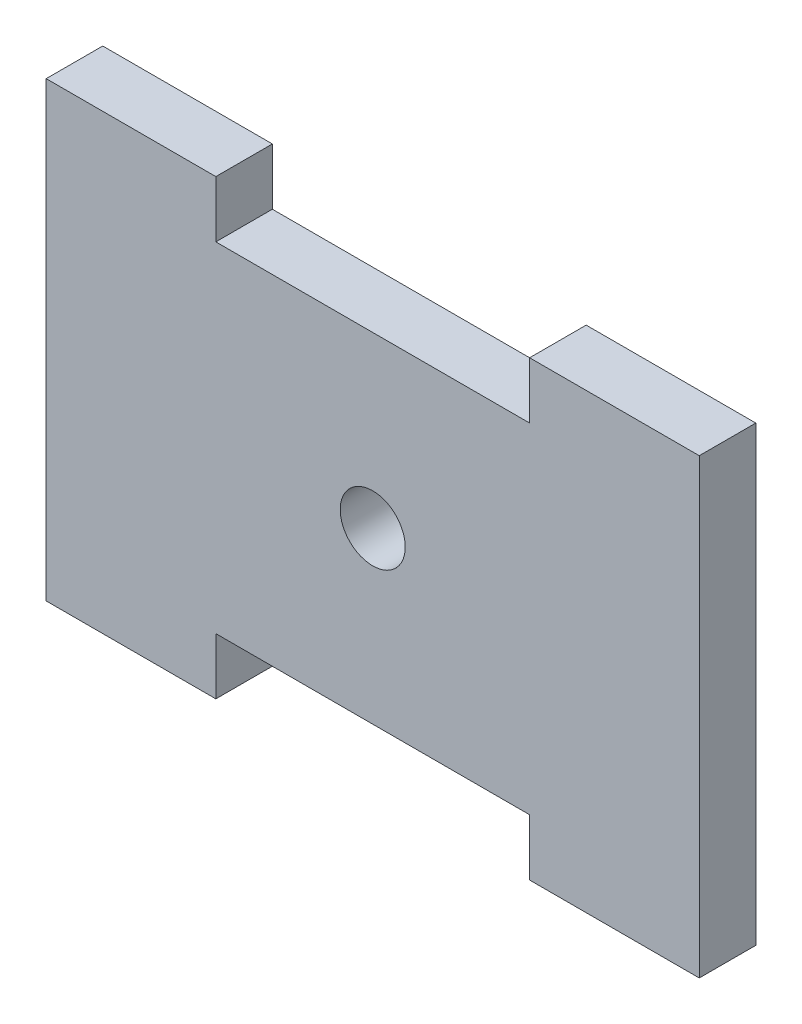
ISO-10303-21;
HEADER;
FILE_DESCRIPTION(('STEP AP214'),'2;1');
FILE_NAME('part.step','',(''),(''),'','','');
FILE_SCHEMA(('AUTOMOTIVE_DESIGN { 1 0 10303 214 1 1 1 1 }'));
ENDSEC;
DATA;
#1=APPLICATION_CONTEXT('core data for automotive mechanical design processes');
#2=APPLICATION_PROTOCOL_DEFINITION('international standard','automotive_design',2000,#1);
#3=PRODUCT_CONTEXT('',#1,'mechanical');
#4=PRODUCT('Part','Part','',(#3));
#5=PRODUCT_RELATED_PRODUCT_CATEGORY('part','',(#4));
#6=PRODUCT_DEFINITION_FORMATION('','',#4);
#7=PRODUCT_DEFINITION_CONTEXT('part definition',#1,'design');
#8=PRODUCT_DEFINITION('design','',#6,#7);
#9=PRODUCT_DEFINITION_SHAPE('','',#8);
#10=(LENGTH_UNIT() NAMED_UNIT(*) SI_UNIT(.MILLI.,.METRE.));
#11=(NAMED_UNIT(*) PLANE_ANGLE_UNIT() SI_UNIT($,.RADIAN.));
#12=(NAMED_UNIT(*) SI_UNIT($,.STERADIAN.) SOLID_ANGLE_UNIT());
#13=UNCERTAINTY_MEASURE_WITH_UNIT(LENGTH_MEASURE(1.E-05),#10,'distance_accuracy_value','');
#14=(GEOMETRIC_REPRESENTATION_CONTEXT(3) GLOBAL_UNCERTAINTY_ASSIGNED_CONTEXT((#13)) GLOBAL_UNIT_ASSIGNED_CONTEXT((#10,
#11,#12)) REPRESENTATION_CONTEXT('',''));
#15=CARTESIAN_POINT('',(0.,0.,0.));
#16=DIRECTION('',(0.,0.,1.));
#17=DIRECTION('',(1.,0.,0.));
#18=AXIS2_PLACEMENT_3D('',#15,#16,#17);
#19=CARTESIAN_POINT('',(3.00000000000001,0.,2.));
#20=DIRECTION('',(-1.,0.,0.));
#21=DIRECTION('',(0.,-1.,0.));
#22=AXIS2_PLACEMENT_3D('',#19,#20,#21);
#23=PLANE('',#22);
#24=DIRECTION('',(0.,1.,0.));
#25=VECTOR('',#24,1.);
#26=CARTESIAN_POINT('',(3.00000000000001,0.,0.));
#27=LINE('',#26,#25);
#28=CARTESIAN_POINT('',(3.,-15.,0.));
#29=VERTEX_POINT('',#28);
#30=CARTESIAN_POINT('',(3.,-13.,0.));
#31=VERTEX_POINT('',#30);
#32=EDGE_CURVE('E174',#29,#31,#27,.T.);
#33=ORIENTED_EDGE('',*,*,#32,.T.);
#34=DIRECTION('',(0.,0.,-1.));
#35=VECTOR('',#34,1.);
#36=CARTESIAN_POINT('',(3.,-13.,2.));
#37=LINE('',#36,#35);
#38=CARTESIAN_POINT('',(3.,-13.,2.));
#39=VERTEX_POINT('',#38);
#40=EDGE_CURVE('E11',#39,#31,#37,.T.);
#41=ORIENTED_EDGE('',*,*,#40,.F.);
#42=DIRECTION('',(0.,1.,0.));
#43=VECTOR('',#42,1.);
#44=CARTESIAN_POINT('',(3.00000000000001,0.,2.));
#45=LINE('',#44,#43);
#46=CARTESIAN_POINT('',(3.,-15.,2.));
#47=VERTEX_POINT('',#46);
#48=EDGE_CURVE('E267',#47,#39,#45,.T.);
#49=ORIENTED_EDGE('',*,*,#48,.F.);
#50=DIRECTION('',(0.,0.,-1.));
#51=VECTOR('',#50,1.);
#52=CARTESIAN_POINT('',(3.,-15.,2.));
#53=LINE('',#52,#51);
#54=EDGE_CURVE('E169',#47,#29,#53,.T.);
#55=ORIENTED_EDGE('',*,*,#54,.T.);
#56=EDGE_LOOP('',(#33,#41,#49,#55));
#57=FACE_BOUND('',#56,.T.);
#58=ADVANCED_FACE('F41',(#57),#23,.F.);
#59=CARTESIAN_POINT('',(0.,-13.,2.));
#60=DIRECTION('',(0.,1.,0.));
#61=DIRECTION('',(0.,0.,1.));
#62=AXIS2_PLACEMENT_3D('',#59,#60,#61);
#63=PLANE('',#62);
#64=DIRECTION('',(1.,0.,0.));
#65=VECTOR('',#64,1.);
#66=CARTESIAN_POINT('',(0.,-13.,0.));
#67=LINE('',#66,#65);
#68=CARTESIAN_POINT('',(14.1,-13.,0.));
#69=VERTEX_POINT('',#68);
#70=EDGE_CURVE('E178',#31,#69,#67,.T.);
#71=ORIENTED_EDGE('',*,*,#70,.T.);
#72=DIRECTION('',(0.,0.,-1.));
#73=VECTOR('',#72,1.);
#74=CARTESIAN_POINT('',(14.1,-13.,2.));
#75=LINE('',#74,#73);
#76=CARTESIAN_POINT('',(14.1,-13.,2.));
#77=VERTEX_POINT('',#76);
#78=EDGE_CURVE('E51',#77,#69,#75,.T.);
#79=ORIENTED_EDGE('',*,*,#78,.F.);
#80=DIRECTION('',(1.,0.,0.));
#81=VECTOR('',#80,1.);
#82=CARTESIAN_POINT('',(0.,-13.,2.));
#83=LINE('',#82,#81);
#84=EDGE_CURVE('E113',#39,#77,#83,.T.);
#85=ORIENTED_EDGE('',*,*,#84,.F.);
#86=ORIENTED_EDGE('',*,*,#40,.T.);
#87=EDGE_LOOP('',(#71,#79,#85,#86));
#88=FACE_BOUND('',#87,.T.);
#89=ADVANCED_FACE('F247',(#88),#63,.F.);
#90=CARTESIAN_POINT('',(14.1,0.,2.));
#91=DIRECTION('',(-1.,0.,0.));
#92=DIRECTION('',(0.,0.,1.));
#93=AXIS2_PLACEMENT_3D('',#90,#91,#92);
#94=PLANE('',#93);
#95=DIRECTION('',(0.,1.,0.));
#96=VECTOR('',#95,1.);
#97=CARTESIAN_POINT('',(14.1,0.,0.));
#98=LINE('',#97,#96);
#99=CARTESIAN_POINT('',(14.1,-15.,0.));
#100=VERTEX_POINT('',#99);
#101=EDGE_CURVE('E182',#100,#69,#98,.T.);
#102=ORIENTED_EDGE('',*,*,#101,.F.);
#103=DIRECTION('',(0.,0.,-1.));
#104=VECTOR('',#103,1.);
#105=CARTESIAN_POINT('',(14.1,-15.,2.));
#106=LINE('',#105,#104);
#107=CARTESIAN_POINT('',(14.1,-15.,2.));
#108=VERTEX_POINT('',#107);
#109=EDGE_CURVE('E238',#108,#100,#106,.T.);
#110=ORIENTED_EDGE('',*,*,#109,.F.);
#111=DIRECTION('',(0.,1.,0.));
#112=VECTOR('',#111,1.);
#113=CARTESIAN_POINT('',(14.1,0.,2.));
#114=LINE('',#113,#112);
#115=EDGE_CURVE('E246',#108,#77,#114,.T.);
#116=ORIENTED_EDGE('',*,*,#115,.T.);
#117=ORIENTED_EDGE('',*,*,#78,.T.);
#118=EDGE_LOOP('',(#102,#110,#116,#117));
#119=FACE_BOUND('',#118,.T.);
#120=ADVANCED_FACE('F244',(#119),#94,.T.);
#121=CARTESIAN_POINT('',(0.,-15.,2.));
#122=DIRECTION('',(0.,-1.,0.));
#123=DIRECTION('',(0.,0.,-1.));
#124=AXIS2_PLACEMENT_3D('',#121,#122,#123);
#125=PLANE('',#124);
#126=DIRECTION('',(-1.,0.,0.));
#127=VECTOR('',#126,1.);
#128=CARTESIAN_POINT('',(0.,-15.,0.));
#129=LINE('',#128,#127);
#130=CARTESIAN_POINT('',(20.1,-15.,0.));
#131=VERTEX_POINT('',#130);
#132=EDGE_CURVE('E186',#131,#100,#129,.T.);
#133=ORIENTED_EDGE('',*,*,#132,.F.);
#134=DIRECTION('',(0.,0.,-1.));
#135=VECTOR('',#134,1.);
#136=CARTESIAN_POINT('',(20.1,-15.,2.));
#137=LINE('',#136,#135);
#138=CARTESIAN_POINT('',(20.1,-15.,2.));
#139=VERTEX_POINT('',#138);
#140=EDGE_CURVE('E235',#139,#131,#137,.T.);
#141=ORIENTED_EDGE('',*,*,#140,.F.);
#142=DIRECTION('',(-1.,0.,0.));
#143=VECTOR('',#142,1.);
#144=CARTESIAN_POINT('',(0.,-15.,2.));
#145=LINE('',#144,#143);
#146=EDGE_CURVE('E260',#139,#108,#145,.T.);
#147=ORIENTED_EDGE('',*,*,#146,.T.);
#148=ORIENTED_EDGE('',*,*,#109,.T.);
#149=EDGE_LOOP('',(#133,#141,#147,#148));
#150=FACE_BOUND('',#149,.T.);
#151=ADVANCED_FACE('F256',(#150),#125,.T.);
#152=CARTESIAN_POINT('',(20.1,0.,2.));
#153=DIRECTION('',(-1.,0.,0.));
#154=DIRECTION('',(0.,0.,1.));
#155=AXIS2_PLACEMENT_3D('',#152,#153,#154);
#156=PLANE('',#155);
#157=DIRECTION('',(0.,1.,0.));
#158=VECTOR('',#157,1.);
#159=CARTESIAN_POINT('',(20.1,0.,0.));
#160=LINE('',#159,#158);
#161=CARTESIAN_POINT('',(20.1,0.999999999999999,0.));
#162=VERTEX_POINT('',#161);
#163=EDGE_CURVE('E190',#131,#162,#160,.T.);
#164=ORIENTED_EDGE('',*,*,#163,.T.);
#165=DIRECTION('',(0.,0.,-1.));
#166=VECTOR('',#165,1.);
#167=CARTESIAN_POINT('',(20.1,0.999999999999999,2.));
#168=LINE('',#167,#166);
#169=CARTESIAN_POINT('',(20.1,0.999999999999999,2.));
#170=VERTEX_POINT('',#169);
#171=EDGE_CURVE('E231',#170,#162,#168,.T.);
#172=ORIENTED_EDGE('',*,*,#171,.F.);
#173=DIRECTION('',(0.,1.,0.));
#174=VECTOR('',#173,1.);
#175=CARTESIAN_POINT('',(20.1,0.,2.));
#176=LINE('',#175,#174);
#177=EDGE_CURVE('E265',#139,#170,#176,.T.);
#178=ORIENTED_EDGE('',*,*,#177,.F.);
#179=ORIENTED_EDGE('',*,*,#140,.T.);
#180=EDGE_LOOP('',(#164,#172,#178,#179));
#181=FACE_BOUND('',#180,.T.);
#182=ADVANCED_FACE('F312',(#181),#156,.F.);
#183=CARTESIAN_POINT('',(0.,0.999999999999999,2.));
#184=DIRECTION('',(0.,-1.,0.));
#185=DIRECTION('',(0.,0.,-1.));
#186=AXIS2_PLACEMENT_3D('',#183,#184,#185);
#187=PLANE('',#186);
#188=DIRECTION('',(-1.,0.,0.));
#189=VECTOR('',#188,1.);
#190=CARTESIAN_POINT('',(0.,0.999999999999999,0.));
#191=LINE('',#190,#189);
#192=CARTESIAN_POINT('',(14.1,0.999999999999999,0.));
#193=VERTEX_POINT('',#192);
#194=EDGE_CURVE('E193',#162,#193,#191,.T.);
#195=ORIENTED_EDGE('',*,*,#194,.T.);
#196=DIRECTION('',(0.,0.,-1.));
#197=VECTOR('',#196,1.);
#198=CARTESIAN_POINT('',(14.1,0.999999999999999,2.));
#199=LINE('',#198,#197);
#200=CARTESIAN_POINT('',(14.1,0.999999999999999,2.));
#201=VERTEX_POINT('',#200);
#202=EDGE_CURVE('E227',#201,#193,#199,.T.);
#203=ORIENTED_EDGE('',*,*,#202,.F.);
#204=DIRECTION('',(-1.,0.,0.));
#205=VECTOR('',#204,1.);
#206=CARTESIAN_POINT('',(0.,0.999999999999999,2.));
#207=LINE('',#206,#205);
#208=EDGE_CURVE('E273',#170,#201,#207,.T.);
#209=ORIENTED_EDGE('',*,*,#208,.F.);
#210=ORIENTED_EDGE('',*,*,#171,.T.);
#211=EDGE_LOOP('',(#195,#203,#209,#210));
#212=FACE_BOUND('',#211,.T.);
#213=ADVANCED_FACE('F315',(#212),#187,.F.);
#214=CARTESIAN_POINT('',(14.1,0.,2.));
#215=DIRECTION('',(1.,0.,0.));
#216=DIRECTION('',(0.,0.,-1.));
#217=AXIS2_PLACEMENT_3D('',#214,#215,#216);
#218=PLANE('',#217);
#219=DIRECTION('',(0.,-1.,0.));
#220=VECTOR('',#219,1.);
#221=CARTESIAN_POINT('',(14.1,0.,0.));
#222=LINE('',#221,#220);
#223=CARTESIAN_POINT('',(14.1,-1.,0.));
#224=VERTEX_POINT('',#223);
#225=EDGE_CURVE('E196',#193,#224,#222,.T.);
#226=ORIENTED_EDGE('',*,*,#225,.T.);
#227=DIRECTION('',(0.,0.,-1.));
#228=VECTOR('',#227,1.);
#229=CARTESIAN_POINT('',(14.1,-1.,2.));
#230=LINE('',#229,#228);
#231=CARTESIAN_POINT('',(14.1,-1.,2.));
#232=VERTEX_POINT('',#231);
#233=EDGE_CURVE('E224',#232,#224,#230,.T.);
#234=ORIENTED_EDGE('',*,*,#233,.F.);
#235=DIRECTION('',(0.,-1.,0.));
#236=VECTOR('',#235,1.);
#237=CARTESIAN_POINT('',(14.1,0.,2.));
#238=LINE('',#237,#236);
#239=EDGE_CURVE('E276',#201,#232,#238,.T.);
#240=ORIENTED_EDGE('',*,*,#239,.F.);
#241=ORIENTED_EDGE('',*,*,#202,.T.);
#242=EDGE_LOOP('',(#226,#234,#240,#241));
#243=FACE_BOUND('',#242,.T.);
#244=ADVANCED_FACE('F319',(#243),#218,.F.);
#245=CARTESIAN_POINT('',(0.,-1.,2.));
#246=DIRECTION('',(0.,1.,0.));
#247=DIRECTION('',(0.,0.,1.));
#248=AXIS2_PLACEMENT_3D('',#245,#246,#247);
#249=PLANE('',#248);
#250=DIRECTION('',(1.,0.,0.));
#251=VECTOR('',#250,1.);
#252=CARTESIAN_POINT('',(0.,-1.,0.));
#253=LINE('',#252,#251);
#254=CARTESIAN_POINT('',(3.,-1.,0.));
#255=VERTEX_POINT('',#254);
#256=EDGE_CURVE('E200',#255,#224,#253,.T.);
#257=ORIENTED_EDGE('',*,*,#256,.F.);
#258=DIRECTION('',(0.,0.,-1.));
#259=VECTOR('',#258,1.);
#260=CARTESIAN_POINT('',(3.,-1.,2.));
#261=LINE('',#260,#259);
#262=CARTESIAN_POINT('',(3.,-1.,2.));
#263=VERTEX_POINT('',#262);
#264=EDGE_CURVE('E221',#263,#255,#261,.T.);
#265=ORIENTED_EDGE('',*,*,#264,.F.);
#266=DIRECTION('',(1.,0.,0.));
#267=VECTOR('',#266,1.);
#268=CARTESIAN_POINT('',(0.,-1.,2.));
#269=LINE('',#268,#267);
#270=EDGE_CURVE('E163',#263,#232,#269,.T.);
#271=ORIENTED_EDGE('',*,*,#270,.T.);
#272=ORIENTED_EDGE('',*,*,#233,.T.);
#273=EDGE_LOOP('',(#257,#265,#271,#272));
#274=FACE_BOUND('',#273,.T.);
#275=ADVANCED_FACE('F282',(#274),#249,.T.);
#276=CARTESIAN_POINT('',(3.,0.,2.));
#277=DIRECTION('',(1.,0.,0.));
#278=DIRECTION('',(0.,1.,0.));
#279=AXIS2_PLACEMENT_3D('',#276,#277,#278);
#280=PLANE('',#279);
#281=DIRECTION('',(0.,-1.,0.));
#282=VECTOR('',#281,1.);
#283=CARTESIAN_POINT('',(3.,0.,0.));
#284=LINE('',#283,#282);
#285=CARTESIAN_POINT('',(3.,0.999999999999999,0.));
#286=VERTEX_POINT('',#285);
#287=EDGE_CURVE('E204',#286,#255,#284,.T.);
#288=ORIENTED_EDGE('',*,*,#287,.F.);
#289=DIRECTION('',(0.,0.,-1.));
#290=VECTOR('',#289,1.);
#291=CARTESIAN_POINT('',(3.,0.999999999999999,2.));
#292=LINE('',#291,#290);
#293=CARTESIAN_POINT('',(3.,0.999999999999999,2.));
#294=VERTEX_POINT('',#293);
#295=EDGE_CURVE('E148',#294,#286,#292,.T.);
#296=ORIENTED_EDGE('',*,*,#295,.F.);
#297=DIRECTION('',(0.,-1.,0.));
#298=VECTOR('',#297,1.);
#299=CARTESIAN_POINT('',(3.,0.,2.));
#300=LINE('',#299,#298);
#301=EDGE_CURVE('E159',#294,#263,#300,.T.);
#302=ORIENTED_EDGE('',*,*,#301,.T.);
#303=ORIENTED_EDGE('',*,*,#264,.T.);
#304=EDGE_LOOP('',(#288,#296,#302,#303));
#305=FACE_BOUND('',#304,.T.);
#306=ADVANCED_FACE('F287',(#305),#280,.T.);
#307=CARTESIAN_POINT('',(0.,0.999999999999999,2.));
#308=DIRECTION('',(0.,1.,0.));
#309=DIRECTION('',(0.,0.,1.));
#310=AXIS2_PLACEMENT_3D('',#307,#308,#309);
#311=PLANE('',#310);
#312=DIRECTION('',(1.,0.,0.));
#313=VECTOR('',#312,1.);
#314=CARTESIAN_POINT('',(0.,0.999999999999999,0.));
#315=LINE('',#314,#313);
#316=CARTESIAN_POINT('',(-3.,0.999999999999999,0.));
#317=VERTEX_POINT('',#316);
#318=EDGE_CURVE('E146',#317,#286,#315,.T.);
#319=ORIENTED_EDGE('',*,*,#318,.F.);
#320=DIRECTION('',(0.,0.,-1.));
#321=VECTOR('',#320,1.);
#322=CARTESIAN_POINT('',(-3.,0.999999999999999,2.));
#323=LINE('',#322,#321);
#324=CARTESIAN_POINT('',(-3.,0.999999999999999,2.));
#325=VERTEX_POINT('',#324);
#326=EDGE_CURVE('E140',#325,#317,#323,.T.);
#327=ORIENTED_EDGE('',*,*,#326,.F.);
#328=DIRECTION('',(1.,0.,0.));
#329=VECTOR('',#328,1.);
#330=CARTESIAN_POINT('',(0.,0.999999999999999,2.));
#331=LINE('',#330,#329);
#332=EDGE_CURVE('E144',#325,#294,#331,.T.);
#333=ORIENTED_EDGE('',*,*,#332,.T.);
#334=ORIENTED_EDGE('',*,*,#295,.T.);
#335=EDGE_LOOP('',(#319,#327,#333,#334));
#336=FACE_BOUND('',#335,.T.);
#337=ADVANCED_FACE('F142',(#336),#311,.T.);
#338=CARTESIAN_POINT('',(-3.,0.,2.));
#339=DIRECTION('',(1.,0.,0.));
#340=DIRECTION('',(0.,0.,-1.));
#341=AXIS2_PLACEMENT_3D('',#338,#339,#340);
#342=PLANE('',#341);
#343=DIRECTION('',(0.,-1.,0.));
#344=VECTOR('',#343,1.);
#345=CARTESIAN_POINT('',(-3.,0.,0.));
#346=LINE('',#345,#344);
#347=CARTESIAN_POINT('',(-3.,-15.,0.));
#348=VERTEX_POINT('',#347);
#349=EDGE_CURVE('E99',#317,#348,#346,.T.);
#350=ORIENTED_EDGE('',*,*,#349,.T.);
#351=DIRECTION('',(0.,0.,-1.));
#352=VECTOR('',#351,1.);
#353=CARTESIAN_POINT('',(-3.,-15.,2.));
#354=LINE('',#353,#352);
#355=CARTESIAN_POINT('',(-3.,-15.,2.));
#356=VERTEX_POINT('',#355);
#357=EDGE_CURVE('E149',#356,#348,#354,.T.);
#358=ORIENTED_EDGE('',*,*,#357,.F.);
#359=DIRECTION('',(0.,-1.,0.));
#360=VECTOR('',#359,1.);
#361=CARTESIAN_POINT('',(-3.,0.,2.));
#362=LINE('',#361,#360);
#363=EDGE_CURVE('E151',#325,#356,#362,.T.);
#364=ORIENTED_EDGE('',*,*,#363,.F.);
#365=ORIENTED_EDGE('',*,*,#326,.T.);
#366=EDGE_LOOP('',(#350,#358,#364,#365));
#367=FACE_BOUND('',#366,.T.);
#368=ADVANCED_FACE('F152',(#367),#342,.F.);
#369=CARTESIAN_POINT('',(8.55,-7.,2.));
#370=DIRECTION('',(0.,0.,-1.));
#371=DIRECTION('',(-1.,0.,0.));
#372=AXIS2_PLACEMENT_3D('',#369,#370,#371);
#373=CYLINDRICAL_SURFACE('',#372,1.15);
#374=CARTESIAN_POINT('',(8.55,-7.,2.));
#375=DIRECTION('',(0.,0.,1.));
#376=DIRECTION('',(1.,0.,0.));
#377=AXIS2_PLACEMENT_3D('',#374,#375,#376);
#378=CIRCLE('',#377,1.15);
#379=CARTESIAN_POINT('',(9.7,-7.,2.));
#380=VERTEX_POINT('',#379);
#381=EDGE_CURVE('E214',#380,#380,#378,.T.);
#382=ORIENTED_EDGE('',*,*,#381,.T.);
#383=EDGE_LOOP('',(#382));
#384=FACE_BOUND('',#383,.T.);
#385=CARTESIAN_POINT('',(8.55,-7.,0.));
#386=DIRECTION('',(0.,0.,1.));
#387=DIRECTION('',(1.,0.,0.));
#388=AXIS2_PLACEMENT_3D('',#385,#386,#387);
#389=CIRCLE('',#388,1.15);
#390=CARTESIAN_POINT('',(9.7,-7.,0.));
#391=VERTEX_POINT('',#390);
#392=EDGE_CURVE('E170',#391,#391,#389,.T.);
#393=ORIENTED_EDGE('',*,*,#392,.F.);
#394=EDGE_LOOP('',(#393));
#395=FACE_BOUND('',#394,.T.);
#396=ADVANCED_FACE('F43',(#384,#395),#373,.F.);
#397=CARTESIAN_POINT('',(0.,-15.,2.));
#398=DIRECTION('',(0.,1.,0.));
#399=DIRECTION('',(0.,0.,1.));
#400=AXIS2_PLACEMENT_3D('',#397,#398,#399);
#401=PLANE('',#400);
#402=DIRECTION('',(1.,0.,0.));
#403=VECTOR('',#402,1.);
#404=CARTESIAN_POINT('',(0.,-15.,0.));
#405=LINE('',#404,#403);
#406=EDGE_CURVE('E105',#348,#29,#405,.T.);
#407=ORIENTED_EDGE('',*,*,#406,.T.);
#408=ORIENTED_EDGE('',*,*,#54,.F.);
#409=DIRECTION('',(1.,0.,0.));
#410=VECTOR('',#409,1.);
#411=CARTESIAN_POINT('',(0.,-15.,2.));
#412=LINE('',#411,#410);
#413=EDGE_CURVE('E59',#356,#47,#412,.T.);
#414=ORIENTED_EDGE('',*,*,#413,.F.);
#415=ORIENTED_EDGE('',*,*,#357,.T.);
#416=EDGE_LOOP('',(#407,#408,#414,#415));
#417=FACE_BOUND('',#416,.T.);
#418=ADVANCED_FACE('F290',(#417),#401,.F.);
#419=CARTESIAN_POINT('',(0.,0.,2.));
#420=DIRECTION('',(0.,0.,1.));
#421=DIRECTION('',(1.,0.,0.));
#422=AXIS2_PLACEMENT_3D('',#419,#420,#421);
#423=PLANE('',#422);
#424=ORIENTED_EDGE('',*,*,#381,.F.);
#425=EDGE_LOOP('',(#424));
#426=FACE_BOUND('',#425,.T.);
#427=ORIENTED_EDGE('',*,*,#48,.T.);
#428=ORIENTED_EDGE('',*,*,#84,.T.);
#429=ORIENTED_EDGE('',*,*,#115,.F.);
#430=ORIENTED_EDGE('',*,*,#146,.F.);
#431=ORIENTED_EDGE('',*,*,#177,.T.);
#432=ORIENTED_EDGE('',*,*,#208,.T.);
#433=ORIENTED_EDGE('',*,*,#239,.T.);
#434=ORIENTED_EDGE('',*,*,#270,.F.);
#435=ORIENTED_EDGE('',*,*,#301,.F.);
#436=ORIENTED_EDGE('',*,*,#332,.F.);
#437=ORIENTED_EDGE('',*,*,#363,.T.);
#438=ORIENTED_EDGE('',*,*,#413,.T.);
#439=EDGE_LOOP('',(#427,#428,#429,#430,#431,#432,#433,#434,#435,#436,#437,#438));
#440=FACE_BOUND('',#439,.T.);
#441=ADVANCED_FACE('F156',(#426,#440),#423,.T.);
#442=CARTESIAN_POINT('',(0.,0.,0.));
#443=DIRECTION('',(0.,0.,1.));
#444=DIRECTION('',(1.,0.,0.));
#445=AXIS2_PLACEMENT_3D('',#442,#443,#444);
#446=PLANE('',#445);
#447=ORIENTED_EDGE('',*,*,#392,.T.);
#448=EDGE_LOOP('',(#447));
#449=FACE_BOUND('',#448,.T.);
#450=ORIENTED_EDGE('',*,*,#32,.F.);
#451=ORIENTED_EDGE('',*,*,#406,.F.);
#452=ORIENTED_EDGE('',*,*,#349,.F.);
#453=ORIENTED_EDGE('',*,*,#318,.T.);
#454=ORIENTED_EDGE('',*,*,#287,.T.);
#455=ORIENTED_EDGE('',*,*,#256,.T.);
#456=ORIENTED_EDGE('',*,*,#225,.F.);
#457=ORIENTED_EDGE('',*,*,#194,.F.);
#458=ORIENTED_EDGE('',*,*,#163,.F.);
#459=ORIENTED_EDGE('',*,*,#132,.T.);
#460=ORIENTED_EDGE('',*,*,#101,.T.);
#461=ORIENTED_EDGE('',*,*,#70,.F.);
#462=EDGE_LOOP('',(#450,#451,#452,#453,#454,#455,#456,#457,#458,#459,#460,#461));
#463=FACE_BOUND('',#462,.T.);
#464=ADVANCED_FACE('F251',(#449,#463),#446,.F.);
#465=CLOSED_SHELL('',(#58,#89,#120,#151,#182,#213,#244,#275,#306,#337,#368,#396,#418,#441,#464));
#466=MANIFOLD_SOLID_BREP('B2',#465);
#467=ADVANCED_BREP_SHAPE_REPRESENTATION('',(#18,#466),#14);
#468=SHAPE_DEFINITION_REPRESENTATION(#9,#467);
ENDSEC;
END-ISO-10303-21;
